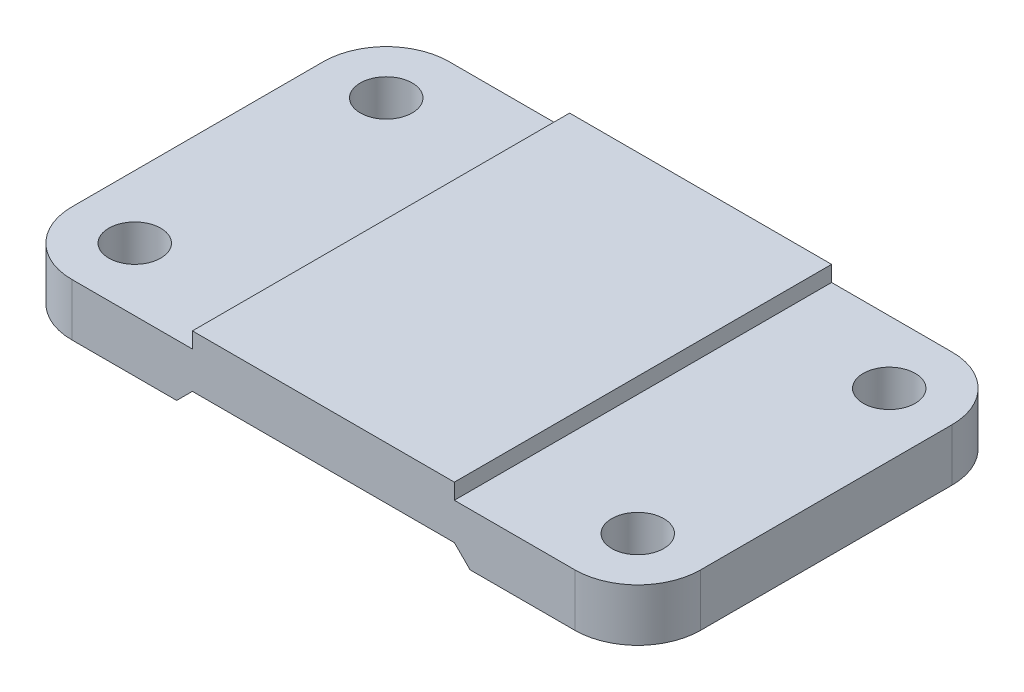
ISO-10303-21;
HEADER;
FILE_DESCRIPTION(('STEP AP214'),'2;1');
FILE_NAME('part.step','',(''),(''),'','','');
FILE_SCHEMA(('AUTOMOTIVE_DESIGN { 1 0 10303 214 1 1 1 1 }'));
ENDSEC;
DATA;
#1=APPLICATION_CONTEXT('core data for automotive mechanical design processes');
#2=APPLICATION_PROTOCOL_DEFINITION('international standard','automotive_design',2000,#1);
#3=PRODUCT_CONTEXT('',#1,'mechanical');
#4=PRODUCT('Part','Part','',(#3));
#5=PRODUCT_RELATED_PRODUCT_CATEGORY('part','',(#4));
#6=PRODUCT_DEFINITION_FORMATION('','',#4);
#7=PRODUCT_DEFINITION_CONTEXT('part definition',#1,'design');
#8=PRODUCT_DEFINITION('design','',#6,#7);
#9=PRODUCT_DEFINITION_SHAPE('','',#8);
#10=(LENGTH_UNIT() NAMED_UNIT(*) SI_UNIT(.MILLI.,.METRE.));
#11=(NAMED_UNIT(*) PLANE_ANGLE_UNIT() SI_UNIT($,.RADIAN.));
#12=(NAMED_UNIT(*) SI_UNIT($,.STERADIAN.) SOLID_ANGLE_UNIT());
#13=UNCERTAINTY_MEASURE_WITH_UNIT(LENGTH_MEASURE(1.E-05),#10,'distance_accuracy_value','');
#14=(GEOMETRIC_REPRESENTATION_CONTEXT(3) GLOBAL_UNCERTAINTY_ASSIGNED_CONTEXT((#13)) GLOBAL_UNIT_ASSIGNED_CONTEXT((#10,
#11,#12)) REPRESENTATION_CONTEXT('',''));
#15=CARTESIAN_POINT('',(0.,0.,0.));
#16=DIRECTION('',(0.,0.,1.));
#17=DIRECTION('',(1.,0.,0.));
#18=AXIS2_PLACEMENT_3D('',#15,#16,#17);
#19=CARTESIAN_POINT('',(0.,10.,0.));
#20=DIRECTION('',(0.,-1.,0.));
#21=DIRECTION('',(0.,0.,-1.));
#22=AXIS2_PLACEMENT_3D('',#19,#20,#21);
#23=PLANE('',#22);
#24=CARTESIAN_POINT('',(48.,10.,24.));
#25=DIRECTION('',(0.,1.,0.));
#26=DIRECTION('',(0.,0.,1.));
#27=AXIS2_PLACEMENT_3D('',#24,#25,#26);
#28=CIRCLE('',#27,4.95970326024094);
#29=CARTESIAN_POINT('',(48.,10.,28.9597032602409));
#30=VERTEX_POINT('',#29);
#31=EDGE_CURVE('E206',#30,#30,#28,.T.);
#32=ORIENTED_EDGE('',*,*,#31,.F.);
#33=EDGE_LOOP('',(#32));
#34=FACE_BOUND('',#33,.T.);
#35=CARTESIAN_POINT('',(48.,10.,-24.));
#36=DIRECTION('',(0.,1.,0.));
#37=DIRECTION('',(0.,0.,-1.));
#38=AXIS2_PLACEMENT_3D('',#35,#36,#37);
#39=CIRCLE('',#38,4.95970326024094);
#40=CARTESIAN_POINT('',(48.,10.,-28.9597032602409));
#41=VERTEX_POINT('',#40);
#42=EDGE_CURVE('E215',#41,#41,#39,.T.);
#43=ORIENTED_EDGE('',*,*,#42,.F.);
#44=EDGE_LOOP('',(#43));
#45=FACE_BOUND('',#44,.T.);
#46=DIRECTION('',(0.,0.,-1.));
#47=VECTOR('',#46,1.);
#48=CARTESIAN_POINT('',(25.,10.,-36.));
#49=LINE('',#48,#47);
#50=CARTESIAN_POINT('',(25.,10.,36.));
#51=VERTEX_POINT('',#50);
#52=CARTESIAN_POINT('',(25.,10.,-36.));
#53=VERTEX_POINT('',#52);
#54=EDGE_CURVE('E175',#51,#53,#49,.T.);
#55=ORIENTED_EDGE('',*,*,#54,.F.);
#56=DIRECTION('',(1.,0.,0.));
#57=VECTOR('',#56,1.);
#58=CARTESIAN_POINT('',(-60.,10.,36.));
#59=LINE('',#58,#57);
#60=CARTESIAN_POINT('',(48.,10.,36.));
#61=VERTEX_POINT('',#60);
#62=EDGE_CURVE('E232',#51,#61,#59,.T.);
#63=ORIENTED_EDGE('',*,*,#62,.T.);
#64=CARTESIAN_POINT('',(48.,10.,24.));
#65=DIRECTION('',(0.,-1.,0.));
#66=DIRECTION('',(0.,0.,-1.));
#67=AXIS2_PLACEMENT_3D('',#64,#65,#66);
#68=CIRCLE('',#67,12.);
#69=CARTESIAN_POINT('',(60.,10.,24.));
#70=VERTEX_POINT('',#69);
#71=EDGE_CURVE('E274',#61,#70,#68,.F.);
#72=ORIENTED_EDGE('',*,*,#71,.T.);
#73=DIRECTION('',(0.,0.,-1.));
#74=VECTOR('',#73,1.);
#75=CARTESIAN_POINT('',(60.,10.,36.));
#76=LINE('',#75,#74);
#77=CARTESIAN_POINT('',(60.,10.,-24.));
#78=VERTEX_POINT('',#77);
#79=EDGE_CURVE('E221',#70,#78,#76,.T.);
#80=ORIENTED_EDGE('',*,*,#79,.T.);
#81=CARTESIAN_POINT('',(48.,10.,-24.));
#82=DIRECTION('',(0.,-1.,0.));
#83=DIRECTION('',(0.,0.,-1.));
#84=AXIS2_PLACEMENT_3D('',#81,#82,#83);
#85=CIRCLE('',#84,12.);
#86=CARTESIAN_POINT('',(48.,10.,-36.));
#87=VERTEX_POINT('',#86);
#88=EDGE_CURVE('E267',#78,#87,#85,.F.);
#89=ORIENTED_EDGE('',*,*,#88,.T.);
#90=DIRECTION('',(-1.,0.,0.));
#91=VECTOR('',#90,1.);
#92=CARTESIAN_POINT('',(-60.,10.,-36.));
#93=LINE('',#92,#91);
#94=EDGE_CURVE('E61',#87,#53,#93,.T.);
#95=ORIENTED_EDGE('',*,*,#94,.T.);
#96=EDGE_LOOP('',(#55,#63,#72,#80,#89,#95));
#97=FACE_BOUND('',#96,.T.);
#98=ADVANCED_FACE('F39',(#34,#45,#97),#23,.F.);
#99=CARTESIAN_POINT('',(-48.,10.,24.));
#100=DIRECTION('',(0.,1.,0.));
#101=DIRECTION('',(0.,0.,-1.));
#102=AXIS2_PLACEMENT_3D('',#99,#100,#101);
#103=CIRCLE('',#102,4.95970326024094);
#104=CARTESIAN_POINT('',(-48.,10.,19.0402967397591));
#105=VERTEX_POINT('',#104);
#106=EDGE_CURVE('E199',#105,#105,#103,.T.);
#107=ORIENTED_EDGE('',*,*,#106,.F.);
#108=EDGE_LOOP('',(#107));
#109=FACE_BOUND('',#108,.T.);
#110=CARTESIAN_POINT('',(-48.,10.,-24.));
#111=DIRECTION('',(0.,1.,0.));
#112=DIRECTION('',(0.,0.,1.));
#113=AXIS2_PLACEMENT_3D('',#110,#111,#112);
#114=CIRCLE('',#113,4.95970326024094);
#115=CARTESIAN_POINT('',(-48.,10.,-19.0402967397591));
#116=VERTEX_POINT('',#115);
#117=EDGE_CURVE('E217',#116,#116,#114,.T.);
#118=ORIENTED_EDGE('',*,*,#117,.F.);
#119=EDGE_LOOP('',(#118));
#120=FACE_BOUND('',#119,.T.);
#121=DIRECTION('',(0.,0.,1.));
#122=VECTOR('',#121,1.);
#123=CARTESIAN_POINT('',(-25.,10.,-36.));
#124=LINE('',#123,#122);
#125=CARTESIAN_POINT('',(-25.,10.,-36.));
#126=VERTEX_POINT('',#125);
#127=CARTESIAN_POINT('',(-25.,10.,35.9999999999999));
#128=VERTEX_POINT('',#127);
#129=EDGE_CURVE('E53',#126,#128,#124,.T.);
#130=ORIENTED_EDGE('',*,*,#129,.F.);
#131=CARTESIAN_POINT('',(-48.,10.,-36.));
#132=VERTEX_POINT('',#131);
#133=EDGE_CURVE('E226',#126,#132,#93,.T.);
#134=ORIENTED_EDGE('',*,*,#133,.T.);
#135=CARTESIAN_POINT('',(-48.,10.,-24.));
#136=DIRECTION('',(0.,-1.,0.));
#137=DIRECTION('',(0.,0.,-1.));
#138=AXIS2_PLACEMENT_3D('',#135,#136,#137);
#139=CIRCLE('',#138,12.);
#140=CARTESIAN_POINT('',(-60.,10.,-24.));
#141=VERTEX_POINT('',#140);
#142=EDGE_CURVE('E271',#132,#141,#139,.F.);
#143=ORIENTED_EDGE('',*,*,#142,.T.);
#144=DIRECTION('',(0.,0.,1.));
#145=VECTOR('',#144,1.);
#146=CARTESIAN_POINT('',(-60.,10.,36.));
#147=LINE('',#146,#145);
#148=CARTESIAN_POINT('',(-60.,10.,24.));
#149=VERTEX_POINT('',#148);
#150=EDGE_CURVE('E227',#141,#149,#147,.T.);
#151=ORIENTED_EDGE('',*,*,#150,.T.);
#152=CARTESIAN_POINT('',(-48.,10.,24.));
#153=DIRECTION('',(0.,-1.,0.));
#154=DIRECTION('',(0.,0.,-1.));
#155=AXIS2_PLACEMENT_3D('',#152,#153,#154);
#156=CIRCLE('',#155,12.);
#157=CARTESIAN_POINT('',(-48.,10.,36.));
#158=VERTEX_POINT('',#157);
#159=EDGE_CURVE('E272',#149,#158,#156,.F.);
#160=ORIENTED_EDGE('',*,*,#159,.T.);
#161=EDGE_CURVE('E233',#158,#128,#59,.T.);
#162=ORIENTED_EDGE('',*,*,#161,.T.);
#163=EDGE_LOOP('',(#130,#134,#143,#151,#160,#162));
#164=FACE_BOUND('',#163,.T.);
#165=ADVANCED_FACE('F351',(#109,#120,#164),#23,.F.);
#166=CARTESIAN_POINT('',(0.,0.,0.));
#167=DIRECTION('',(0.,-1.,0.));
#168=DIRECTION('',(0.,0.,-1.));
#169=AXIS2_PLACEMENT_3D('',#166,#167,#168);
#170=PLANE('',#169);
#171=CARTESIAN_POINT('',(-48.,0.,24.));
#172=DIRECTION('',(0.,1.,0.));
#173=DIRECTION('',(0.,0.,-1.));
#174=AXIS2_PLACEMENT_3D('',#171,#172,#173);
#175=CIRCLE('',#174,4.95970326024094);
#176=CARTESIAN_POINT('',(-48.,0.,19.0402967397591));
#177=VERTEX_POINT('',#176);
#178=EDGE_CURVE('E200',#177,#177,#175,.T.);
#179=ORIENTED_EDGE('',*,*,#178,.T.);
#180=EDGE_LOOP('',(#179));
#181=FACE_BOUND('',#180,.T.);
#182=CARTESIAN_POINT('',(-48.,0.,-24.));
#183=DIRECTION('',(0.,1.,0.));
#184=DIRECTION('',(0.,0.,1.));
#185=AXIS2_PLACEMENT_3D('',#182,#183,#184);
#186=CIRCLE('',#185,4.95970326024094);
#187=CARTESIAN_POINT('',(-48.,0.,-19.0402967397591));
#188=VERTEX_POINT('',#187);
#189=EDGE_CURVE('E214',#188,#188,#186,.T.);
#190=ORIENTED_EDGE('',*,*,#189,.T.);
#191=EDGE_LOOP('',(#190));
#192=FACE_BOUND('',#191,.T.);
#193=DIRECTION('',(-1.,0.,0.));
#194=VECTOR('',#193,1.);
#195=CARTESIAN_POINT('',(-60.,0.,-36.));
#196=LINE('',#195,#194);
#197=CARTESIAN_POINT('',(-28.,0.,-36.));
#198=VERTEX_POINT('',#197);
#199=CARTESIAN_POINT('',(-48.,0.,-36.));
#200=VERTEX_POINT('',#199);
#201=EDGE_CURVE('E239',#198,#200,#196,.T.);
#202=ORIENTED_EDGE('',*,*,#201,.F.);
#203=DIRECTION('',(0.,0.,1.));
#204=VECTOR('',#203,1.);
#205=CARTESIAN_POINT('',(-28.,0.,-37.));
#206=LINE('',#205,#204);
#207=CARTESIAN_POINT('',(-28.,0.,36.));
#208=VERTEX_POINT('',#207);
#209=EDGE_CURVE('E193',#198,#208,#206,.T.);
#210=ORIENTED_EDGE('',*,*,#209,.T.);
#211=DIRECTION('',(1.,0.,0.));
#212=VECTOR('',#211,1.);
#213=CARTESIAN_POINT('',(-60.,0.,36.));
#214=LINE('',#213,#212);
#215=CARTESIAN_POINT('',(-48.,0.,36.));
#216=VERTEX_POINT('',#215);
#217=EDGE_CURVE('E230',#216,#208,#214,.T.);
#218=ORIENTED_EDGE('',*,*,#217,.F.);
#219=CARTESIAN_POINT('',(-48.,0.,24.));
#220=DIRECTION('',(0.,-1.,0.));
#221=DIRECTION('',(0.,0.,-1.));
#222=AXIS2_PLACEMENT_3D('',#219,#220,#221);
#223=CIRCLE('',#222,12.);
#224=CARTESIAN_POINT('',(-60.,0.,24.));
#225=VERTEX_POINT('',#224);
#226=EDGE_CURVE('E256',#216,#225,#223,.T.);
#227=ORIENTED_EDGE('',*,*,#226,.T.);
#228=DIRECTION('',(0.,0.,1.));
#229=VECTOR('',#228,1.);
#230=CARTESIAN_POINT('',(-60.,0.,36.));
#231=LINE('',#230,#229);
#232=CARTESIAN_POINT('',(-60.,0.,-24.));
#233=VERTEX_POINT('',#232);
#234=EDGE_CURVE('E245',#233,#225,#231,.T.);
#235=ORIENTED_EDGE('',*,*,#234,.F.);
#236=CARTESIAN_POINT('',(-48.,0.,-24.));
#237=DIRECTION('',(0.,-1.,0.));
#238=DIRECTION('',(0.,0.,-1.));
#239=AXIS2_PLACEMENT_3D('',#236,#237,#238);
#240=CIRCLE('',#239,12.);
#241=EDGE_CURVE('E254',#233,#200,#240,.T.);
#242=ORIENTED_EDGE('',*,*,#241,.T.);
#243=EDGE_LOOP('',(#202,#210,#218,#227,#235,#242));
#244=FACE_BOUND('',#243,.T.);
#245=ADVANCED_FACE('F291',(#181,#192,#244),#170,.T.);
#246=CARTESIAN_POINT('',(-60.,10.,-36.));
#247=DIRECTION('',(0.,0.,1.));
#248=DIRECTION('',(1.,0.,0.));
#249=AXIS2_PLACEMENT_3D('',#246,#247,#248);
#250=PLANE('',#249);
#251=DIRECTION('',(0.707106781186548,-0.707106781186547,0.));
#252=VECTOR('',#251,1.);
#253=CARTESIAN_POINT('',(-21.,49.,-36.));
#254=LINE('',#253,#252);
#255=CARTESIAN_POINT('',(25.,3.,-36.));
#256=VERTEX_POINT('',#255);
#257=CARTESIAN_POINT('',(28.,0.,-36.));
#258=VERTEX_POINT('',#257);
#259=EDGE_CURVE('E11',#256,#258,#254,.T.);
#260=ORIENTED_EDGE('',*,*,#259,.F.);
#261=DIRECTION('',(1.,0.,0.));
#262=VECTOR('',#261,1.);
#263=CARTESIAN_POINT('',(-60.,3.,-36.));
#264=LINE('',#263,#262);
#265=CARTESIAN_POINT('',(-25.,3.,-36.));
#266=VERTEX_POINT('',#265);
#267=EDGE_CURVE('E191',#266,#256,#264,.T.);
#268=ORIENTED_EDGE('',*,*,#267,.F.);
#269=DIRECTION('',(-0.707106781186548,-0.707106781186547,0.));
#270=VECTOR('',#269,1.);
#271=CARTESIAN_POINT('',(-39.,-11.,-36.));
#272=LINE('',#271,#270);
#273=EDGE_CURVE('E50',#266,#198,#272,.T.);
#274=ORIENTED_EDGE('',*,*,#273,.T.);
#275=ORIENTED_EDGE('',*,*,#201,.T.);
#276=DIRECTION('',(0.,-1.,0.));
#277=VECTOR('',#276,1.);
#278=CARTESIAN_POINT('',(-48.,10.,-36.));
#279=LINE('',#278,#277);
#280=EDGE_CURVE('E282',#200,#132,#279,.F.);
#281=ORIENTED_EDGE('',*,*,#280,.T.);
#282=ORIENTED_EDGE('',*,*,#133,.F.);
#283=DIRECTION('',(0.,-1.,0.));
#284=VECTOR('',#283,1.);
#285=CARTESIAN_POINT('',(-25.,13.,-36.));
#286=LINE('',#285,#284);
#287=CARTESIAN_POINT('',(-25.,13.,-36.));
#288=VERTEX_POINT('',#287);
#289=EDGE_CURVE('E158',#288,#126,#286,.T.);
#290=ORIENTED_EDGE('',*,*,#289,.F.);
#291=DIRECTION('',(-1.,0.,0.));
#292=VECTOR('',#291,1.);
#293=CARTESIAN_POINT('',(-25.,13.,-36.));
#294=LINE('',#293,#292);
#295=CARTESIAN_POINT('',(25.,13.,-36.));
#296=VERTEX_POINT('',#295);
#297=EDGE_CURVE('E147',#296,#288,#294,.T.);
#298=ORIENTED_EDGE('',*,*,#297,.F.);
#299=DIRECTION('',(0.,-1.,0.));
#300=VECTOR('',#299,1.);
#301=CARTESIAN_POINT('',(25.,13.,-36.));
#302=LINE('',#301,#300);
#303=EDGE_CURVE('E154',#296,#53,#302,.T.);
#304=ORIENTED_EDGE('',*,*,#303,.T.);
#305=ORIENTED_EDGE('',*,*,#94,.F.);
#306=DIRECTION('',(0.,-1.,0.));
#307=VECTOR('',#306,1.);
#308=CARTESIAN_POINT('',(48.,10.,-36.));
#309=LINE('',#308,#307);
#310=CARTESIAN_POINT('',(48.,0.,-36.));
#311=VERTEX_POINT('',#310);
#312=EDGE_CURVE('E281',#87,#311,#309,.T.);
#313=ORIENTED_EDGE('',*,*,#312,.T.);
#314=EDGE_CURVE('E238',#311,#258,#196,.T.);
#315=ORIENTED_EDGE('',*,*,#314,.T.);
#316=EDGE_LOOP('',(#260,#268,#274,#275,#281,#282,#290,#298,#304,#305,#313,#315));
#317=FACE_BOUND('',#316,.T.);
#318=ADVANCED_FACE('F153',(#317),#250,.F.);
#319=CARTESIAN_POINT('',(-60.,10.,36.));
#320=DIRECTION('',(0.,0.,-1.));
#321=DIRECTION('',(-1.,0.,0.));
#322=AXIS2_PLACEMENT_3D('',#319,#320,#321);
#323=PLANE('',#322);
#324=DIRECTION('',(-0.707106781186548,-0.707106781186547,0.));
#325=VECTOR('',#324,1.);
#326=CARTESIAN_POINT('',(-14.,14.,36.));
#327=LINE('',#326,#325);
#328=CARTESIAN_POINT('',(-25.,3.,36.));
#329=VERTEX_POINT('',#328);
#330=EDGE_CURVE('E180',#329,#208,#327,.T.);
#331=ORIENTED_EDGE('',*,*,#330,.F.);
#332=DIRECTION('',(1.,0.,0.));
#333=VECTOR('',#332,1.);
#334=CARTESIAN_POINT('',(0.,3.,36.));
#335=LINE('',#334,#333);
#336=CARTESIAN_POINT('',(25.,3.,36.));
#337=VERTEX_POINT('',#336);
#338=EDGE_CURVE('E173',#329,#337,#335,.T.);
#339=ORIENTED_EDGE('',*,*,#338,.T.);
#340=DIRECTION('',(0.707106781186548,-0.707106781186547,0.));
#341=VECTOR('',#340,1.);
#342=CARTESIAN_POINT('',(14.,14.,36.));
#343=LINE('',#342,#341);
#344=CARTESIAN_POINT('',(28.,0.,36.));
#345=VERTEX_POINT('',#344);
#346=EDGE_CURVE('E184',#337,#345,#343,.T.);
#347=ORIENTED_EDGE('',*,*,#346,.T.);
#348=CARTESIAN_POINT('',(48.,0.,36.));
#349=VERTEX_POINT('',#348);
#350=EDGE_CURVE('E246',#345,#349,#214,.T.);
#351=ORIENTED_EDGE('',*,*,#350,.T.);
#352=DIRECTION('',(0.,-1.,0.));
#353=VECTOR('',#352,1.);
#354=CARTESIAN_POINT('',(48.,10.,36.));
#355=LINE('',#354,#353);
#356=EDGE_CURVE('E266',#349,#61,#355,.F.);
#357=ORIENTED_EDGE('',*,*,#356,.T.);
#358=ORIENTED_EDGE('',*,*,#62,.F.);
#359=DIRECTION('',(0.,-1.,0.));
#360=VECTOR('',#359,1.);
#361=CARTESIAN_POINT('',(25.,13.,36.));
#362=LINE('',#361,#360);
#363=CARTESIAN_POINT('',(25.,13.,36.));
#364=VERTEX_POINT('',#363);
#365=EDGE_CURVE('E308',#364,#51,#362,.T.);
#366=ORIENTED_EDGE('',*,*,#365,.F.);
#367=DIRECTION('',(1.,0.,0.));
#368=VECTOR('',#367,1.);
#369=CARTESIAN_POINT('',(25.,13.,36.));
#370=LINE('',#369,#368);
#371=CARTESIAN_POINT('',(-25.,13.,35.9999999999999));
#372=VERTEX_POINT('',#371);
#373=EDGE_CURVE('E170',#372,#364,#370,.T.);
#374=ORIENTED_EDGE('',*,*,#373,.F.);
#375=DIRECTION('',(0.,-1.,0.));
#376=VECTOR('',#375,1.);
#377=CARTESIAN_POINT('',(-25.,13.,35.9999999999999));
#378=LINE('',#377,#376);
#379=EDGE_CURVE('E178',#372,#128,#378,.T.);
#380=ORIENTED_EDGE('',*,*,#379,.T.);
#381=ORIENTED_EDGE('',*,*,#161,.F.);
#382=DIRECTION('',(0.,-1.,0.));
#383=VECTOR('',#382,1.);
#384=CARTESIAN_POINT('',(-48.,10.,36.));
#385=LINE('',#384,#383);
#386=EDGE_CURVE('E263',#158,#216,#385,.T.);
#387=ORIENTED_EDGE('',*,*,#386,.T.);
#388=ORIENTED_EDGE('',*,*,#217,.T.);
#389=EDGE_LOOP('',(#331,#339,#347,#351,#357,#358,#366,#374,#380,#381,#387,#388));
#390=FACE_BOUND('',#389,.T.);
#391=ADVANCED_FACE('F314',(#390),#323,.F.);
#392=DIRECTION('',(0.,0.,1.));
#393=VECTOR('',#392,1.);
#394=CARTESIAN_POINT('',(28.,0.,-37.));
#395=LINE('',#394,#393);
#396=EDGE_CURVE('E195',#258,#345,#395,.T.);
#397=ORIENTED_EDGE('',*,*,#396,.F.);
#398=ORIENTED_EDGE('',*,*,#314,.F.);
#399=CARTESIAN_POINT('',(48.,0.,-24.));
#400=DIRECTION('',(0.,-1.,0.));
#401=DIRECTION('',(0.,0.,-1.));
#402=AXIS2_PLACEMENT_3D('',#399,#400,#401);
#403=CIRCLE('',#402,12.);
#404=CARTESIAN_POINT('',(60.,0.,-24.));
#405=VERTEX_POINT('',#404);
#406=EDGE_CURVE('E251',#311,#405,#403,.T.);
#407=ORIENTED_EDGE('',*,*,#406,.T.);
#408=DIRECTION('',(0.,0.,-1.));
#409=VECTOR('',#408,1.);
#410=CARTESIAN_POINT('',(60.,0.,36.));
#411=LINE('',#410,#409);
#412=CARTESIAN_POINT('',(60.,0.,24.));
#413=VERTEX_POINT('',#412);
#414=EDGE_CURVE('E222',#413,#405,#411,.T.);
#415=ORIENTED_EDGE('',*,*,#414,.F.);
#416=CARTESIAN_POINT('',(48.,0.,24.));
#417=DIRECTION('',(0.,-1.,0.));
#418=DIRECTION('',(0.,0.,-1.));
#419=AXIS2_PLACEMENT_3D('',#416,#417,#418);
#420=CIRCLE('',#419,12.);
#421=EDGE_CURVE('E257',#413,#349,#420,.T.);
#422=ORIENTED_EDGE('',*,*,#421,.T.);
#423=ORIENTED_EDGE('',*,*,#350,.F.);
#424=EDGE_LOOP('',(#397,#398,#407,#415,#422,#423));
#425=FACE_BOUND('',#424,.T.);
#426=CARTESIAN_POINT('',(48.,0.,24.));
#427=DIRECTION('',(0.,1.,0.));
#428=DIRECTION('',(0.,0.,1.));
#429=AXIS2_PLACEMENT_3D('',#426,#427,#428);
#430=CIRCLE('',#429,4.95970326024094);
#431=CARTESIAN_POINT('',(48.,0.,28.9597032602409));
#432=VERTEX_POINT('',#431);
#433=EDGE_CURVE('E201',#432,#432,#430,.T.);
#434=ORIENTED_EDGE('',*,*,#433,.T.);
#435=EDGE_LOOP('',(#434));
#436=FACE_BOUND('',#435,.T.);
#437=CARTESIAN_POINT('',(48.,0.,-24.));
#438=DIRECTION('',(0.,1.,0.));
#439=DIRECTION('',(0.,0.,-1.));
#440=AXIS2_PLACEMENT_3D('',#437,#438,#439);
#441=CIRCLE('',#440,4.95970326024094);
#442=CARTESIAN_POINT('',(48.,0.,-28.9597032602409));
#443=VERTEX_POINT('',#442);
#444=EDGE_CURVE('E207',#443,#443,#441,.T.);
#445=ORIENTED_EDGE('',*,*,#444,.T.);
#446=EDGE_LOOP('',(#445));
#447=FACE_BOUND('',#446,.T.);
#448=ADVANCED_FACE('F332',(#425,#436,#447),#170,.T.);
#449=CARTESIAN_POINT('',(60.,10.,36.));
#450=DIRECTION('',(-1.,0.,0.));
#451=DIRECTION('',(0.,0.,1.));
#452=AXIS2_PLACEMENT_3D('',#449,#450,#451);
#453=PLANE('',#452);
#454=ORIENTED_EDGE('',*,*,#79,.F.);
#455=DIRECTION('',(0.,-1.,0.));
#456=VECTOR('',#455,1.);
#457=CARTESIAN_POINT('',(60.,10.,24.));
#458=LINE('',#457,#456);
#459=EDGE_CURVE('E249',#70,#413,#458,.T.);
#460=ORIENTED_EDGE('',*,*,#459,.T.);
#461=ORIENTED_EDGE('',*,*,#414,.T.);
#462=DIRECTION('',(0.,-1.,0.));
#463=VECTOR('',#462,1.);
#464=CARTESIAN_POINT('',(60.,10.,-24.));
#465=LINE('',#464,#463);
#466=EDGE_CURVE('E237',#405,#78,#465,.F.);
#467=ORIENTED_EDGE('',*,*,#466,.T.);
#468=EDGE_LOOP('',(#454,#460,#461,#467));
#469=FACE_BOUND('',#468,.T.);
#470=ADVANCED_FACE('F322',(#469),#453,.F.);
#471=CARTESIAN_POINT('',(-60.,10.,36.));
#472=DIRECTION('',(1.,0.,0.));
#473=DIRECTION('',(0.,0.,-1.));
#474=AXIS2_PLACEMENT_3D('',#471,#472,#473);
#475=PLANE('',#474);
#476=ORIENTED_EDGE('',*,*,#234,.T.);
#477=DIRECTION('',(0.,-1.,0.));
#478=VECTOR('',#477,1.);
#479=CARTESIAN_POINT('',(-60.,10.,24.));
#480=LINE('',#479,#478);
#481=EDGE_CURVE('E278',#225,#149,#480,.F.);
#482=ORIENTED_EDGE('',*,*,#481,.T.);
#483=ORIENTED_EDGE('',*,*,#150,.F.);
#484=DIRECTION('',(0.,-1.,0.));
#485=VECTOR('',#484,1.);
#486=CARTESIAN_POINT('',(-60.,10.,-24.));
#487=LINE('',#486,#485);
#488=EDGE_CURVE('E280',#141,#233,#487,.T.);
#489=ORIENTED_EDGE('',*,*,#488,.T.);
#490=EDGE_LOOP('',(#476,#482,#483,#489));
#491=FACE_BOUND('',#490,.T.);
#492=ADVANCED_FACE('F369',(#491),#475,.F.);
#493=CARTESIAN_POINT('',(-48.,10.,-24.));
#494=DIRECTION('',(0.,-1.,0.));
#495=DIRECTION('',(0.,0.,-1.));
#496=AXIS2_PLACEMENT_3D('',#493,#494,#495);
#497=CYLINDRICAL_SURFACE('',#496,4.95970326024094);
#498=ORIENTED_EDGE('',*,*,#117,.T.);
#499=EDGE_LOOP('',(#498));
#500=FACE_BOUND('',#499,.T.);
#501=ORIENTED_EDGE('',*,*,#189,.F.);
#502=EDGE_LOOP('',(#501));
#503=FACE_BOUND('',#502,.T.);
#504=ADVANCED_FACE('F361',(#500,#503),#497,.F.);
#505=CARTESIAN_POINT('',(48.,10.,-24.));
#506=DIRECTION('',(0.,-1.,0.));
#507=DIRECTION('',(0.,0.,-1.));
#508=AXIS2_PLACEMENT_3D('',#505,#506,#507);
#509=CYLINDRICAL_SURFACE('',#508,4.95970326024094);
#510=ORIENTED_EDGE('',*,*,#42,.T.);
#511=EDGE_LOOP('',(#510));
#512=FACE_BOUND('',#511,.T.);
#513=ORIENTED_EDGE('',*,*,#444,.F.);
#514=EDGE_LOOP('',(#513));
#515=FACE_BOUND('',#514,.T.);
#516=ADVANCED_FACE('F496',(#512,#515),#509,.F.);
#517=CARTESIAN_POINT('',(48.,10.,24.));
#518=DIRECTION('',(0.,-1.,0.));
#519=DIRECTION('',(0.,0.,-1.));
#520=AXIS2_PLACEMENT_3D('',#517,#518,#519);
#521=CYLINDRICAL_SURFACE('',#520,4.95970326024094);
#522=ORIENTED_EDGE('',*,*,#31,.T.);
#523=EDGE_LOOP('',(#522));
#524=FACE_BOUND('',#523,.T.);
#525=ORIENTED_EDGE('',*,*,#433,.F.);
#526=EDGE_LOOP('',(#525));
#527=FACE_BOUND('',#526,.T.);
#528=ADVANCED_FACE('F489',(#524,#527),#521,.F.);
#529=CARTESIAN_POINT('',(-48.,10.,24.));
#530=DIRECTION('',(0.,-1.,0.));
#531=DIRECTION('',(0.,0.,-1.));
#532=AXIS2_PLACEMENT_3D('',#529,#530,#531);
#533=CYLINDRICAL_SURFACE('',#532,4.95970326024094);
#534=ORIENTED_EDGE('',*,*,#106,.T.);
#535=EDGE_LOOP('',(#534));
#536=FACE_BOUND('',#535,.T.);
#537=ORIENTED_EDGE('',*,*,#178,.F.);
#538=EDGE_LOOP('',(#537));
#539=FACE_BOUND('',#538,.T.);
#540=ADVANCED_FACE('F379',(#536,#539),#533,.F.);
#541=CARTESIAN_POINT('',(48.,10.,24.));
#542=DIRECTION('',(0.,-1.,0.));
#543=DIRECTION('',(0.,0.,-1.));
#544=AXIS2_PLACEMENT_3D('',#541,#542,#543);
#545=CYLINDRICAL_SURFACE('',#544,12.);
#546=ORIENTED_EDGE('',*,*,#71,.F.);
#547=ORIENTED_EDGE('',*,*,#356,.F.);
#548=ORIENTED_EDGE('',*,*,#421,.F.);
#549=ORIENTED_EDGE('',*,*,#459,.F.);
#550=EDGE_LOOP('',(#546,#547,#548,#549));
#551=FACE_BOUND('',#550,.T.);
#552=ADVANCED_FACE('F330',(#551),#545,.T.);
#553=CARTESIAN_POINT('',(-48.,10.,24.));
#554=DIRECTION('',(0.,-1.,0.));
#555=DIRECTION('',(0.,0.,-1.));
#556=AXIS2_PLACEMENT_3D('',#553,#554,#555);
#557=CYLINDRICAL_SURFACE('',#556,12.);
#558=ORIENTED_EDGE('',*,*,#159,.F.);
#559=ORIENTED_EDGE('',*,*,#481,.F.);
#560=ORIENTED_EDGE('',*,*,#226,.F.);
#561=ORIENTED_EDGE('',*,*,#386,.F.);
#562=EDGE_LOOP('',(#558,#559,#560,#561));
#563=FACE_BOUND('',#562,.T.);
#564=ADVANCED_FACE('F377',(#563),#557,.T.);
#565=CARTESIAN_POINT('',(-48.,10.,-24.));
#566=DIRECTION('',(0.,-1.,0.));
#567=DIRECTION('',(0.,0.,-1.));
#568=AXIS2_PLACEMENT_3D('',#565,#566,#567);
#569=CYLINDRICAL_SURFACE('',#568,12.);
#570=ORIENTED_EDGE('',*,*,#142,.F.);
#571=ORIENTED_EDGE('',*,*,#280,.F.);
#572=ORIENTED_EDGE('',*,*,#241,.F.);
#573=ORIENTED_EDGE('',*,*,#488,.F.);
#574=EDGE_LOOP('',(#570,#571,#572,#573));
#575=FACE_BOUND('',#574,.T.);
#576=ADVANCED_FACE('F297',(#575),#569,.T.);
#577=CARTESIAN_POINT('',(48.,10.,-24.));
#578=DIRECTION('',(0.,-1.,0.));
#579=DIRECTION('',(0.,0.,-1.));
#580=AXIS2_PLACEMENT_3D('',#577,#578,#579);
#581=CYLINDRICAL_SURFACE('',#580,12.);
#582=ORIENTED_EDGE('',*,*,#88,.F.);
#583=ORIENTED_EDGE('',*,*,#466,.F.);
#584=ORIENTED_EDGE('',*,*,#406,.F.);
#585=ORIENTED_EDGE('',*,*,#312,.F.);
#586=EDGE_LOOP('',(#582,#583,#584,#585));
#587=FACE_BOUND('',#586,.T.);
#588=ADVANCED_FACE('F41',(#587),#581,.T.);
#589=CARTESIAN_POINT('',(14.,14.,-37.));
#590=DIRECTION('',(-0.707106781186547,-0.707106781186548,0.));
#591=DIRECTION('',(0.707106781186548,-0.707106781186547,0.));
#592=AXIS2_PLACEMENT_3D('',#589,#590,#591);
#593=PLANE('',#592);
#594=ORIENTED_EDGE('',*,*,#259,.T.);
#595=ORIENTED_EDGE('',*,*,#396,.T.);
#596=ORIENTED_EDGE('',*,*,#346,.F.);
#597=DIRECTION('',(0.,0.,1.));
#598=VECTOR('',#597,1.);
#599=CARTESIAN_POINT('',(25.,3.,-37.));
#600=LINE('',#599,#598);
#601=EDGE_CURVE('E190',#256,#337,#600,.T.);
#602=ORIENTED_EDGE('',*,*,#601,.F.);
#603=EDGE_LOOP('',(#594,#595,#596,#602));
#604=FACE_BOUND('',#603,.T.);
#605=ADVANCED_FACE('F336',(#604),#593,.T.);
#606=CARTESIAN_POINT('',(-14.,14.,-37.));
#607=DIRECTION('',(-0.707106781186547,0.707106781186548,0.));
#608=DIRECTION('',(-0.707106781186548,-0.707106781186547,0.));
#609=AXIS2_PLACEMENT_3D('',#606,#607,#608);
#610=PLANE('',#609);
#611=DIRECTION('',(0.,0.,1.));
#612=VECTOR('',#611,1.);
#613=CARTESIAN_POINT('',(-25.,3.,-37.));
#614=LINE('',#613,#612);
#615=EDGE_CURVE('E186',#266,#329,#614,.T.);
#616=ORIENTED_EDGE('',*,*,#615,.T.);
#617=ORIENTED_EDGE('',*,*,#330,.T.);
#618=ORIENTED_EDGE('',*,*,#209,.F.);
#619=ORIENTED_EDGE('',*,*,#273,.F.);
#620=EDGE_LOOP('',(#616,#617,#618,#619));
#621=FACE_BOUND('',#620,.T.);
#622=ADVANCED_FACE('F345',(#621),#610,.F.);
#623=CARTESIAN_POINT('',(0.,3.,-37.));
#624=DIRECTION('',(0.,-1.,0.));
#625=DIRECTION('',(0.,0.,-1.));
#626=AXIS2_PLACEMENT_3D('',#623,#624,#625);
#627=PLANE('',#626);
#628=ORIENTED_EDGE('',*,*,#267,.T.);
#629=ORIENTED_EDGE('',*,*,#601,.T.);
#630=ORIENTED_EDGE('',*,*,#338,.F.);
#631=ORIENTED_EDGE('',*,*,#615,.F.);
#632=EDGE_LOOP('',(#628,#629,#630,#631));
#633=FACE_BOUND('',#632,.T.);
#634=ADVANCED_FACE('F341',(#633),#627,.T.);
#635=CARTESIAN_POINT('',(25.,13.,-36.));
#636=DIRECTION('',(-1.,0.,0.));
#637=DIRECTION('',(0.,0.,1.));
#638=AXIS2_PLACEMENT_3D('',#635,#636,#637);
#639=PLANE('',#638);
#640=ORIENTED_EDGE('',*,*,#54,.T.);
#641=ORIENTED_EDGE('',*,*,#303,.F.);
#642=DIRECTION('',(0.,0.,-1.));
#643=VECTOR('',#642,1.);
#644=CARTESIAN_POINT('',(25.,13.,-36.));
#645=LINE('',#644,#643);
#646=EDGE_CURVE('E165',#364,#296,#645,.T.);
#647=ORIENTED_EDGE('',*,*,#646,.F.);
#648=ORIENTED_EDGE('',*,*,#365,.T.);
#649=EDGE_LOOP('',(#640,#641,#647,#648));
#650=FACE_BOUND('',#649,.T.);
#651=ADVANCED_FACE('F171',(#650),#639,.F.);
#652=CARTESIAN_POINT('',(-25.,13.,-36.));
#653=DIRECTION('',(1.,0.,0.));
#654=DIRECTION('',(0.,0.,-1.));
#655=AXIS2_PLACEMENT_3D('',#652,#653,#654);
#656=PLANE('',#655);
#657=ORIENTED_EDGE('',*,*,#129,.T.);
#658=ORIENTED_EDGE('',*,*,#379,.F.);
#659=DIRECTION('',(0.,0.,1.));
#660=VECTOR('',#659,1.);
#661=CARTESIAN_POINT('',(-25.,13.,-36.));
#662=LINE('',#661,#660);
#663=EDGE_CURVE('E161',#288,#372,#662,.T.);
#664=ORIENTED_EDGE('',*,*,#663,.F.);
#665=ORIENTED_EDGE('',*,*,#289,.T.);
#666=EDGE_LOOP('',(#657,#658,#664,#665));
#667=FACE_BOUND('',#666,.T.);
#668=ADVANCED_FACE('F305',(#667),#656,.F.);
#669=CARTESIAN_POINT('',(0.,13.,0.));
#670=DIRECTION('',(0.,-1.,0.));
#671=DIRECTION('',(0.,0.,-1.));
#672=AXIS2_PLACEMENT_3D('',#669,#670,#671);
#673=PLANE('',#672);
#674=ORIENTED_EDGE('',*,*,#646,.T.);
#675=ORIENTED_EDGE('',*,*,#297,.T.);
#676=ORIENTED_EDGE('',*,*,#663,.T.);
#677=ORIENTED_EDGE('',*,*,#373,.T.);
#678=EDGE_LOOP('',(#674,#675,#676,#677));
#679=FACE_BOUND('',#678,.T.);
#680=ADVANCED_FACE('F164',(#679),#673,.F.);
#681=CLOSED_SHELL('',(#98,#165,#245,#318,#391,#448,#470,#492,#504,#516,#528,#540,#552,#564,#576,
#588,#605,#622,#634,#651,#668,#680));
#682=MANIFOLD_SOLID_BREP('B2',#681);
#683=ADVANCED_BREP_SHAPE_REPRESENTATION('',(#18,#682),#14);
#684=SHAPE_DEFINITION_REPRESENTATION(#9,#683);
ENDSEC;
END-ISO-10303-21;
